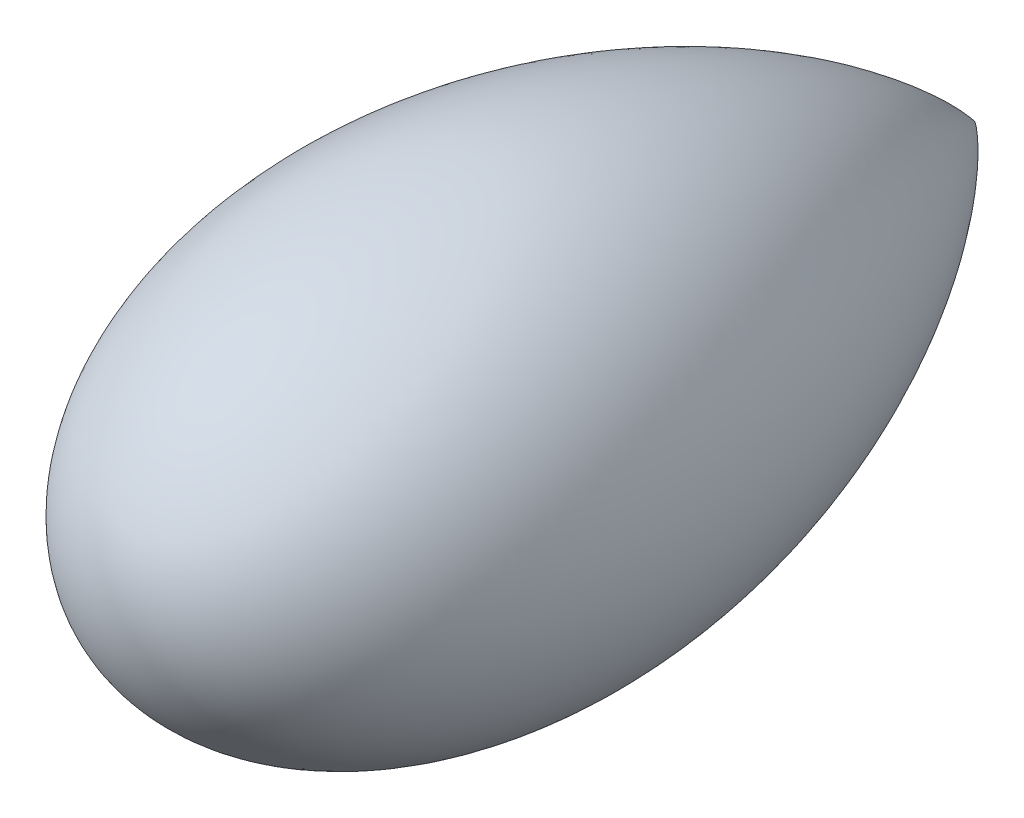
ISO-10303-21;
HEADER;
FILE_DESCRIPTION(('STEP AP214'),'2;1');
FILE_NAME('part.step','',(''),(''),'','','');
FILE_SCHEMA(('AUTOMOTIVE_DESIGN { 1 0 10303 214 1 1 1 1 }'));
ENDSEC;
DATA;
#1=APPLICATION_CONTEXT('core data for automotive mechanical design processes');
#2=APPLICATION_PROTOCOL_DEFINITION('international standard','automotive_design',2000,#1);
#3=PRODUCT_CONTEXT('',#1,'mechanical');
#4=PRODUCT('Part','Part','',(#3));
#5=PRODUCT_RELATED_PRODUCT_CATEGORY('part','',(#4));
#6=PRODUCT_DEFINITION_FORMATION('','',#4);
#7=PRODUCT_DEFINITION_CONTEXT('part definition',#1,'design');
#8=PRODUCT_DEFINITION('design','',#6,#7);
#9=PRODUCT_DEFINITION_SHAPE('','',#8);
#10=(LENGTH_UNIT() NAMED_UNIT(*) SI_UNIT(.MILLI.,.METRE.));
#11=(NAMED_UNIT(*) PLANE_ANGLE_UNIT() SI_UNIT($,.RADIAN.));
#12=(NAMED_UNIT(*) SI_UNIT($,.STERADIAN.) SOLID_ANGLE_UNIT());
#13=UNCERTAINTY_MEASURE_WITH_UNIT(LENGTH_MEASURE(1.E-05),#10,'distance_accuracy_value','');
#14=(GEOMETRIC_REPRESENTATION_CONTEXT(3) GLOBAL_UNCERTAINTY_ASSIGNED_CONTEXT((#13)) GLOBAL_UNIT_ASSIGNED_CONTEXT((#10,
#11,#12)) REPRESENTATION_CONTEXT('',''));
#15=CARTESIAN_POINT('',(0.,0.,0.));
#16=DIRECTION('',(0.,0.,1.));
#17=DIRECTION('',(1.,0.,0.));
#18=AXIS2_PLACEMENT_3D('',#15,#16,#17);
#19=CARTESIAN_POINT('',(-1.59744263229573E-13,0.,21.3227192364473));
#20=CARTESIAN_POINT('',(0.0605600851374161,0.,21.3227192364473));
#21=CARTESIAN_POINT('',(0.18052447084827,0.,21.3196416488283));
#22=CARTESIAN_POINT('',(0.367253435553436,0.,21.3081007327531));
#23=CARTESIAN_POINT('',(0.555099954305899,0.,21.2828538482068));
#24=CARTESIAN_POINT('',(0.716031376089234,0.,21.2543544839529));
#25=CARTESIAN_POINT('',(0.844484831998543,0.,21.2271460866288));
#26=CARTESIAN_POINT('',(1.00384668062249,0.,21.1877226172179));
#27=CARTESIAN_POINT('',(1.19225597834363,0.,21.1319306277738));
#28=CARTESIAN_POINT('',(1.40986644893581,0.,21.0543856421346));
#29=CARTESIAN_POINT('',(1.65358201661464,0.,20.9495379866467));
#30=CARTESIAN_POINT('',(1.91954629545285,0.,20.8149898556674));
#31=CARTESIAN_POINT('',(2.20381439490075,0.,20.6455348772837));
#32=CARTESIAN_POINT('',(2.50037552064597,0.,20.4374653876273));
#33=CARTESIAN_POINT('',(2.80407151518423,0.,20.187245640245));
#34=CARTESIAN_POINT('',(3.16020470363259,0.,19.8480703849216));
#35=CARTESIAN_POINT('',(3.55002285408275,0.,19.404299117935));
#36=CARTESIAN_POINT('',(3.95126616854436,0.,18.8437311144076));
#37=CARTESIAN_POINT('',(4.43664961336909,0.,17.9905573006488));
#38=CARTESIAN_POINT('',(4.89148726452161,0.,16.9017870305576));
#39=CARTESIAN_POINT('',(5.25626167174163,0.,15.5734800440547));
#40=CARTESIAN_POINT('',(5.47630484215267,0.,14.0155820653388));
#41=CARTESIAN_POINT('',(5.52275474623012,0.,12.4409072350931));
#42=CARTESIAN_POINT('',(5.41325463369003,0.,10.8698472301706));
#43=CARTESIAN_POINT('',(5.16140884157796,0.,9.31556741862955));
#44=CARTESIAN_POINT('',(4.77743695562606,0.,7.78873548428222));
#45=CARTESIAN_POINT('',(4.26875583085819,0.,6.2989069501735));
#46=CARTESIAN_POINT('',(3.64033929904611,0.,4.85548320022225));
#47=CARTESIAN_POINT('',(2.89456999099139,0.,3.46893515665883));
#48=CARTESIAN_POINT('',(2.1425622228563,0.,2.32283287604821));
#49=CARTESIAN_POINT('',(1.42614440038182,0.,1.40222976444918));
#50=CARTESIAN_POINT('',(0.851142921162121,0.,0.768816275465529));
#51=CARTESIAN_POINT('',(0.462580630449089,0.,0.387077097571629));
#52=CARTESIAN_POINT('',(0.195923126656699,0.,0.152384324671855));
#53=CARTESIAN_POINT('',(0.0663117351554888,0.,0.0495330631106807));
#54=CARTESIAN_POINT('',(0.,0.,0.));
#55=B_SPLINE_CURVE_WITH_KNOTS('',4,(#19,#20,#21,#22,#23,#24,#25,#26,#27,#28,#29,#30,#31,#32,#33,
#34,#35,#36,#37,#38,#39,#40,#41,#42,#43,#44,#45,#46,#47,#48,#49,#50,#51,#52,#53,#54),
.UNSPECIFIED.,.F.,.F.,(5,1,1,1,1,1,1,1,1,1,1,1,1,1,1,1,1,1,1,1,1,1,1,1,1,1,1,1,1,1,1,1,5),
(0.075727273648214,0.0852251902132587,0.0947231067783033,0.0994720692332456,0.104221031688188,
0.10896999414313,0.113718956598072,0.123216879822465,0.132714803046858,0.142432647675104,
0.15215049230335,0.166397447324557,0.180644402345764,0.194891233087148,0.209138063828531,
0.237631810695735,0.266125767747669,0.294619399363612,0.351197461360832,0.408185109509772,
0.465172649296407,0.522160251464682,0.579147822960017,0.636135418479735,0.693122967885307,
0.750110545802865,0.807098279092534,0.864085824216971,0.921073538054691,0.948543207210811,
0.97601287636693,0.988006438183465,1.),.UNSPECIFIED.);
#56=CARTESIAN_POINT('',(0.,0.,0.));
#57=DIRECTION('',(0.,0.,-1.));
#58=AXIS1_PLACEMENT('',#56,#57);
#59=SURFACE_OF_REVOLUTION('',#55,#58);
#60=CARTESIAN_POINT('',(0.,0.,0.));
#61=VERTEX_POINT('',#60);
#62=VERTEX_LOOP('',#61);
#63=FACE_BOUND('',#62,.T.);
#64=CARTESIAN_POINT('',(0.,0.,21.3227192364473));
#65=VERTEX_POINT('',#64);
#66=VERTEX_LOOP('',#65);
#67=FACE_BOUND('',#66,.T.);
#68=ADVANCED_FACE('F40',(#63,#67),#59,.T.);
#69=CLOSED_SHELL('',(#68));
#70=MANIFOLD_SOLID_BREP('B2',#69);
#71=ADVANCED_BREP_SHAPE_REPRESENTATION('',(#18,#70),#14);
#72=SHAPE_DEFINITION_REPRESENTATION(#9,#71);
ENDSEC;
END-ISO-10303-21;
